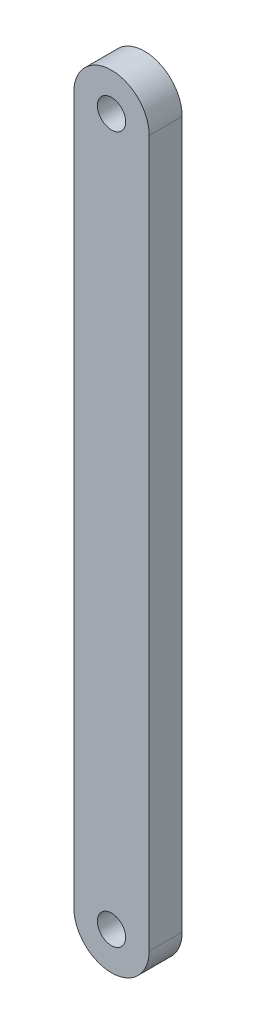
ISO-10303-21;
HEADER;
FILE_DESCRIPTION(('STEP AP214'),'2;1');
FILE_NAME('part.step','',(''),(''),'','','');
FILE_SCHEMA(('AUTOMOTIVE_DESIGN { 1 0 10303 214 1 1 1 1 }'));
ENDSEC;
DATA;
#1=APPLICATION_CONTEXT('core data for automotive mechanical design processes');
#2=APPLICATION_PROTOCOL_DEFINITION('international standard','automotive_design',2000,#1);
#3=PRODUCT_CONTEXT('',#1,'mechanical');
#4=PRODUCT('Part','Part','',(#3));
#5=PRODUCT_RELATED_PRODUCT_CATEGORY('part','',(#4));
#6=PRODUCT_DEFINITION_FORMATION('','',#4);
#7=PRODUCT_DEFINITION_CONTEXT('part definition',#1,'design');
#8=PRODUCT_DEFINITION('design','',#6,#7);
#9=PRODUCT_DEFINITION_SHAPE('','',#8);
#10=(LENGTH_UNIT() NAMED_UNIT(*) SI_UNIT(.MILLI.,.METRE.));
#11=(NAMED_UNIT(*) PLANE_ANGLE_UNIT() SI_UNIT($,.RADIAN.));
#12=(NAMED_UNIT(*) SI_UNIT($,.STERADIAN.) SOLID_ANGLE_UNIT());
#13=UNCERTAINTY_MEASURE_WITH_UNIT(LENGTH_MEASURE(1.E-05),#10,'distance_accuracy_value','');
#14=(GEOMETRIC_REPRESENTATION_CONTEXT(3) GLOBAL_UNCERTAINTY_ASSIGNED_CONTEXT((#13)) GLOBAL_UNIT_ASSIGNED_CONTEXT((#10,
#11,#12)) REPRESENTATION_CONTEXT('',''));
#15=CARTESIAN_POINT('',(0.,0.,0.));
#16=DIRECTION('',(0.,0.,1.));
#17=DIRECTION('',(1.,0.,0.));
#18=AXIS2_PLACEMENT_3D('',#15,#16,#17);
#19=CARTESIAN_POINT('',(0.,75.,3.5));
#20=DIRECTION('',(0.,0.,-1.));
#21=DIRECTION('',(-1.,0.,0.));
#22=AXIS2_PLACEMENT_3D('',#19,#20,#21);
#23=PLANE('',#22);
#24=CARTESIAN_POINT('',(0.,75.,3.5));
#25=DIRECTION('',(0.,0.,1.));
#26=DIRECTION('',(-1.,0.,0.));
#27=AXIS2_PLACEMENT_3D('',#24,#25,#26);
#28=CIRCLE('',#27,4.);
#29=CARTESIAN_POINT('',(4.,75.,3.5));
#30=VERTEX_POINT('',#29);
#31=CARTESIAN_POINT('',(-4.,75.,3.5));
#32=VERTEX_POINT('',#31);
#33=EDGE_CURVE('E88',#30,#32,#28,.T.);
#34=ORIENTED_EDGE('',*,*,#33,.T.);
#35=DIRECTION('',(0.,-1.,0.));
#36=VECTOR('',#35,1.);
#37=CARTESIAN_POINT('',(-4.,75.,3.5));
#38=LINE('',#37,#36);
#39=CARTESIAN_POINT('',(-4.,0.,3.5));
#40=VERTEX_POINT('',#39);
#41=EDGE_CURVE('E83',#32,#40,#38,.T.);
#42=ORIENTED_EDGE('',*,*,#41,.T.);
#43=CARTESIAN_POINT('',(0.,0.,3.5));
#44=DIRECTION('',(0.,0.,1.));
#45=DIRECTION('',(1.,0.,0.));
#46=AXIS2_PLACEMENT_3D('',#43,#44,#45);
#47=CIRCLE('',#46,4.);
#48=CARTESIAN_POINT('',(4.,0.,3.5));
#49=VERTEX_POINT('',#48);
#50=EDGE_CURVE('E86',#40,#49,#47,.T.);
#51=ORIENTED_EDGE('',*,*,#50,.T.);
#52=DIRECTION('',(0.,1.,0.));
#53=VECTOR('',#52,1.);
#54=CARTESIAN_POINT('',(4.,0.,3.5));
#55=LINE('',#54,#53);
#56=EDGE_CURVE('E53',#49,#30,#55,.T.);
#57=ORIENTED_EDGE('',*,*,#56,.T.);
#58=EDGE_LOOP('',(#34,#42,#51,#57));
#59=FACE_BOUND('',#58,.T.);
#60=CARTESIAN_POINT('',(0.,75.,3.5));
#61=DIRECTION('',(0.,0.,1.));
#62=DIRECTION('',(1.,0.,0.));
#63=AXIS2_PLACEMENT_3D('',#60,#61,#62);
#64=CIRCLE('',#63,1.5);
#65=CARTESIAN_POINT('',(1.5,75.,3.5));
#66=VERTEX_POINT('',#65);
#67=EDGE_CURVE('E103',#66,#66,#64,.T.);
#68=ORIENTED_EDGE('',*,*,#67,.F.);
#69=EDGE_LOOP('',(#68));
#70=FACE_BOUND('',#69,.T.);
#71=CARTESIAN_POINT('',(0.,0.,3.5));
#72=DIRECTION('',(0.,0.,1.));
#73=DIRECTION('',(1.,0.,0.));
#74=AXIS2_PLACEMENT_3D('',#71,#72,#73);
#75=CIRCLE('',#74,1.5);
#76=CARTESIAN_POINT('',(1.5,0.,3.5));
#77=VERTEX_POINT('',#76);
#78=EDGE_CURVE('E118',#77,#77,#75,.T.);
#79=ORIENTED_EDGE('',*,*,#78,.F.);
#80=EDGE_LOOP('',(#79));
#81=FACE_BOUND('',#80,.T.);
#82=ADVANCED_FACE('F36',(#59,#70,#81),#23,.F.);
#83=CARTESIAN_POINT('',(0.,75.,0.));
#84=DIRECTION('',(0.,0.,-1.));
#85=DIRECTION('',(-1.,0.,0.));
#86=AXIS2_PLACEMENT_3D('',#83,#84,#85);
#87=PLANE('',#86);
#88=CARTESIAN_POINT('',(0.,75.,0.));
#89=DIRECTION('',(0.,0.,1.));
#90=DIRECTION('',(1.,0.,0.));
#91=AXIS2_PLACEMENT_3D('',#88,#89,#90);
#92=CIRCLE('',#91,1.5);
#93=CARTESIAN_POINT('',(1.5,75.,0.));
#94=VERTEX_POINT('',#93);
#95=EDGE_CURVE('E114',#94,#94,#92,.T.);
#96=ORIENTED_EDGE('',*,*,#95,.T.);
#97=EDGE_LOOP('',(#96));
#98=FACE_BOUND('',#97,.T.);
#99=CARTESIAN_POINT('',(0.,75.,0.));
#100=DIRECTION('',(0.,0.,1.));
#101=DIRECTION('',(-1.,0.,0.));
#102=AXIS2_PLACEMENT_3D('',#99,#100,#101);
#103=CIRCLE('',#102,4.);
#104=CARTESIAN_POINT('',(4.,75.,0.));
#105=VERTEX_POINT('',#104);
#106=CARTESIAN_POINT('',(-4.,75.,0.));
#107=VERTEX_POINT('',#106);
#108=EDGE_CURVE('E100',#105,#107,#103,.T.);
#109=ORIENTED_EDGE('',*,*,#108,.F.);
#110=DIRECTION('',(0.,1.,0.));
#111=VECTOR('',#110,1.);
#112=CARTESIAN_POINT('',(4.,0.,0.));
#113=LINE('',#112,#111);
#114=CARTESIAN_POINT('',(4.,0.,0.));
#115=VERTEX_POINT('',#114);
#116=EDGE_CURVE('E76',#115,#105,#113,.T.);
#117=ORIENTED_EDGE('',*,*,#116,.F.);
#118=CARTESIAN_POINT('',(0.,0.,0.));
#119=DIRECTION('',(0.,0.,1.));
#120=DIRECTION('',(1.,0.,0.));
#121=AXIS2_PLACEMENT_3D('',#118,#119,#120);
#122=CIRCLE('',#121,4.);
#123=CARTESIAN_POINT('',(-4.,0.,0.));
#124=VERTEX_POINT('',#123);
#125=EDGE_CURVE('E70',#124,#115,#122,.T.);
#126=ORIENTED_EDGE('',*,*,#125,.F.);
#127=DIRECTION('',(0.,-1.,0.));
#128=VECTOR('',#127,1.);
#129=CARTESIAN_POINT('',(-4.,75.,0.));
#130=LINE('',#129,#128);
#131=EDGE_CURVE('E92',#107,#124,#130,.T.);
#132=ORIENTED_EDGE('',*,*,#131,.F.);
#133=EDGE_LOOP('',(#109,#117,#126,#132));
#134=FACE_BOUND('',#133,.T.);
#135=CARTESIAN_POINT('',(0.,0.,0.));
#136=DIRECTION('',(0.,0.,1.));
#137=DIRECTION('',(1.,0.,0.));
#138=AXIS2_PLACEMENT_3D('',#135,#136,#137);
#139=CIRCLE('',#138,1.5);
#140=CARTESIAN_POINT('',(1.5,0.,0.));
#141=VERTEX_POINT('',#140);
#142=EDGE_CURVE('E121',#141,#141,#139,.T.);
#143=ORIENTED_EDGE('',*,*,#142,.T.);
#144=EDGE_LOOP('',(#143));
#145=FACE_BOUND('',#144,.T.);
#146=ADVANCED_FACE('F111',(#98,#134,#145),#87,.T.);
#147=CARTESIAN_POINT('',(0.,75.,3.5));
#148=DIRECTION('',(0.,0.,-1.));
#149=DIRECTION('',(-1.,0.,0.));
#150=AXIS2_PLACEMENT_3D('',#147,#148,#149);
#151=CYLINDRICAL_SURFACE('',#150,4.);
#152=ORIENTED_EDGE('',*,*,#108,.T.);
#153=DIRECTION('',(0.,0.,-1.));
#154=VECTOR('',#153,1.);
#155=CARTESIAN_POINT('',(-4.,75.,3.5));
#156=LINE('',#155,#154);
#157=EDGE_CURVE('E12',#32,#107,#156,.T.);
#158=ORIENTED_EDGE('',*,*,#157,.F.);
#159=ORIENTED_EDGE('',*,*,#33,.F.);
#160=DIRECTION('',(0.,0.,-1.));
#161=VECTOR('',#160,1.);
#162=CARTESIAN_POINT('',(4.,75.,3.5));
#163=LINE('',#162,#161);
#164=EDGE_CURVE('E96',#30,#105,#163,.T.);
#165=ORIENTED_EDGE('',*,*,#164,.T.);
#166=EDGE_LOOP('',(#152,#158,#159,#165));
#167=FACE_BOUND('',#166,.T.);
#168=ADVANCED_FACE('F38',(#167),#151,.T.);
#169=CARTESIAN_POINT('',(-4.,75.,3.5));
#170=DIRECTION('',(1.,0.,0.));
#171=DIRECTION('',(0.,0.,-1.));
#172=AXIS2_PLACEMENT_3D('',#169,#170,#171);
#173=PLANE('',#172);
#174=ORIENTED_EDGE('',*,*,#131,.T.);
#175=DIRECTION('',(0.,0.,-1.));
#176=VECTOR('',#175,1.);
#177=CARTESIAN_POINT('',(-4.,0.,3.5));
#178=LINE('',#177,#176);
#179=EDGE_CURVE('E45',#40,#124,#178,.T.);
#180=ORIENTED_EDGE('',*,*,#179,.F.);
#181=ORIENTED_EDGE('',*,*,#41,.F.);
#182=ORIENTED_EDGE('',*,*,#157,.T.);
#183=EDGE_LOOP('',(#174,#180,#181,#182));
#184=FACE_BOUND('',#183,.T.);
#185=ADVANCED_FACE('F91',(#184),#173,.F.);
#186=CARTESIAN_POINT('',(0.,0.,3.5));
#187=DIRECTION('',(0.,0.,-1.));
#188=DIRECTION('',(-1.,0.,0.));
#189=AXIS2_PLACEMENT_3D('',#186,#187,#188);
#190=CYLINDRICAL_SURFACE('',#189,4.);
#191=ORIENTED_EDGE('',*,*,#125,.T.);
#192=DIRECTION('',(0.,0.,-1.));
#193=VECTOR('',#192,1.);
#194=CARTESIAN_POINT('',(4.,0.,3.5));
#195=LINE('',#194,#193);
#196=EDGE_CURVE('E93',#49,#115,#195,.T.);
#197=ORIENTED_EDGE('',*,*,#196,.F.);
#198=ORIENTED_EDGE('',*,*,#50,.F.);
#199=ORIENTED_EDGE('',*,*,#179,.T.);
#200=EDGE_LOOP('',(#191,#197,#198,#199));
#201=FACE_BOUND('',#200,.T.);
#202=ADVANCED_FACE('F94',(#201),#190,.T.);
#203=CARTESIAN_POINT('',(4.,0.,3.5));
#204=DIRECTION('',(-1.,0.,0.));
#205=DIRECTION('',(0.,0.,1.));
#206=AXIS2_PLACEMENT_3D('',#203,#204,#205);
#207=PLANE('',#206);
#208=ORIENTED_EDGE('',*,*,#116,.T.);
#209=ORIENTED_EDGE('',*,*,#164,.F.);
#210=ORIENTED_EDGE('',*,*,#56,.F.);
#211=ORIENTED_EDGE('',*,*,#196,.T.);
#212=EDGE_LOOP('',(#208,#209,#210,#211));
#213=FACE_BOUND('',#212,.T.);
#214=ADVANCED_FACE('F108',(#213),#207,.F.);
#215=CARTESIAN_POINT('',(0.,75.,3.5));
#216=DIRECTION('',(0.,0.,-1.));
#217=DIRECTION('',(-1.,0.,0.));
#218=AXIS2_PLACEMENT_3D('',#215,#216,#217);
#219=CYLINDRICAL_SURFACE('',#218,1.5);
#220=ORIENTED_EDGE('',*,*,#67,.T.);
#221=EDGE_LOOP('',(#220));
#222=FACE_BOUND('',#221,.T.);
#223=ORIENTED_EDGE('',*,*,#95,.F.);
#224=EDGE_LOOP('',(#223));
#225=FACE_BOUND('',#224,.T.);
#226=ADVANCED_FACE('F138',(#222,#225),#219,.F.);
#227=CARTESIAN_POINT('',(0.,0.,3.5));
#228=DIRECTION('',(0.,0.,-1.));
#229=DIRECTION('',(-1.,0.,0.));
#230=AXIS2_PLACEMENT_3D('',#227,#228,#229);
#231=CYLINDRICAL_SURFACE('',#230,1.5);
#232=ORIENTED_EDGE('',*,*,#78,.T.);
#233=EDGE_LOOP('',(#232));
#234=FACE_BOUND('',#233,.T.);
#235=ORIENTED_EDGE('',*,*,#142,.F.);
#236=EDGE_LOOP('',(#235));
#237=FACE_BOUND('',#236,.T.);
#238=ADVANCED_FACE('F127',(#234,#237),#231,.F.);
#239=CLOSED_SHELL('',(#82,#146,#168,#185,#202,#214,#226,#238));
#240=MANIFOLD_SOLID_BREP('B2',#239);
#241=ADVANCED_BREP_SHAPE_REPRESENTATION('',(#18,#240),#14);
#242=SHAPE_DEFINITION_REPRESENTATION(#9,#241);
ENDSEC;
END-ISO-10303-21;
